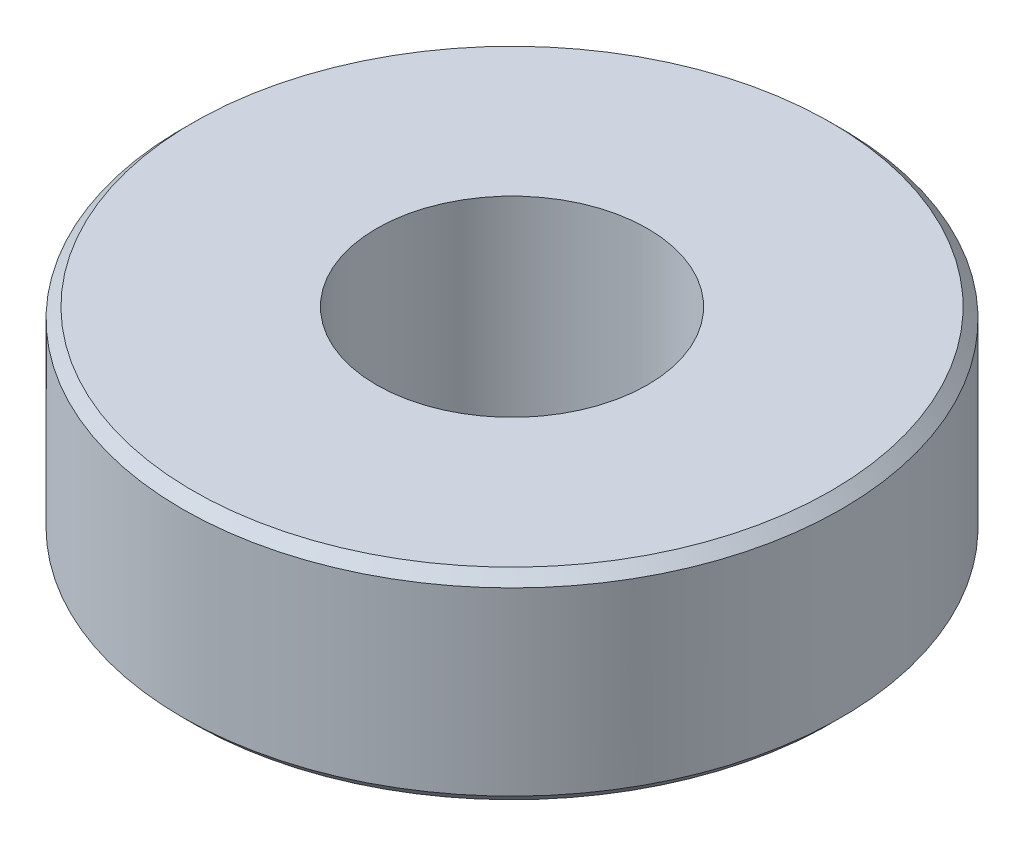
ISO-10303-21;
HEADER;
FILE_DESCRIPTION(('STEP AP214'),'2;1');
FILE_NAME('part.step','',(''),(''),'','','');
FILE_SCHEMA(('AUTOMOTIVE_DESIGN { 1 0 10303 214 1 1 1 1 }'));
ENDSEC;
DATA;
#1=APPLICATION_CONTEXT('core data for automotive mechanical design processes');
#2=APPLICATION_PROTOCOL_DEFINITION('international standard','automotive_design',2000,#1);
#3=PRODUCT_CONTEXT('',#1,'mechanical');
#4=PRODUCT('Part','Part','',(#3));
#5=PRODUCT_RELATED_PRODUCT_CATEGORY('part','',(#4));
#6=PRODUCT_DEFINITION_FORMATION('','',#4);
#7=PRODUCT_DEFINITION_CONTEXT('part definition',#1,'design');
#8=PRODUCT_DEFINITION('design','',#6,#7);
#9=PRODUCT_DEFINITION_SHAPE('','',#8);
#10=(LENGTH_UNIT() NAMED_UNIT(*) SI_UNIT(.MILLI.,.METRE.));
#11=(NAMED_UNIT(*) PLANE_ANGLE_UNIT() SI_UNIT($,.RADIAN.));
#12=(NAMED_UNIT(*) SI_UNIT($,.STERADIAN.) SOLID_ANGLE_UNIT());
#13=UNCERTAINTY_MEASURE_WITH_UNIT(LENGTH_MEASURE(1.E-05),#10,'distance_accuracy_value','');
#14=(GEOMETRIC_REPRESENTATION_CONTEXT(3) GLOBAL_UNCERTAINTY_ASSIGNED_CONTEXT((#13)) GLOBAL_UNIT_ASSIGNED_CONTEXT((#10,
#11,#12)) REPRESENTATION_CONTEXT('',''));
#15=CARTESIAN_POINT('',(0.,0.,0.));
#16=DIRECTION('',(0.,0.,1.));
#17=DIRECTION('',(1.,0.,0.));
#18=AXIS2_PLACEMENT_3D('',#15,#16,#17);
#19=CARTESIAN_POINT('',(0.,-47.3192446211727,13.335));
#20=DIRECTION('',(0.,-1.,0.));
#21=DIRECTION('',(1.,0.,0.));
#22=AXIS2_PLACEMENT_3D('',#19,#20,#21);
#23=CONICAL_SURFACE('',#22,7.9375,0.785398163397448);
#24=CARTESIAN_POINT('',(0.,-47.3192446211727,13.335));
#25=DIRECTION('',(0.,1.,0.));
#26=DIRECTION('',(0.,0.,1.));
#27=AXIS2_PLACEMENT_3D('',#24,#25,#26);
#28=CIRCLE('',#27,7.9375);
#29=CARTESIAN_POINT('',(0.,-47.3192446211727,21.2725));
#30=VERTEX_POINT('',#29);
#31=EDGE_CURVE('E29',#30,#30,#28,.F.);
#32=ORIENTED_EDGE('',*,*,#31,.F.);
#33=EDGE_LOOP('',(#32));
#34=FACE_BOUND('',#33,.T.);
#35=CARTESIAN_POINT('',(0.,-47.0652446211727,13.335));
#36=DIRECTION('',(0.,-1.,0.));
#37=DIRECTION('',(1.,0.,0.));
#38=AXIS2_PLACEMENT_3D('',#35,#36,#37);
#39=CIRCLE('',#38,7.6835);
#40=CARTESIAN_POINT('',(7.68349999999993,-47.0652446211727,13.335));
#41=VERTEX_POINT('',#40);
#42=EDGE_CURVE('E17',#41,#41,#39,.T.);
#43=ORIENTED_EDGE('',*,*,#42,.T.);
#44=EDGE_LOOP('',(#43));
#45=FACE_BOUND('',#44,.T.);
#46=ADVANCED_FACE('F14',(#34,#45),#23,.T.);
#47=CARTESIAN_POINT('',(0.,-47.0652446211727,13.335));
#48=DIRECTION('',(0.,-1.,0.));
#49=DIRECTION('',(0.,0.,-1.));
#50=AXIS2_PLACEMENT_3D('',#47,#48,#49);
#51=PLANE('',#50);
#52=ORIENTED_EDGE('',*,*,#42,.F.);
#53=EDGE_LOOP('',(#52));
#54=FACE_BOUND('',#53,.T.);
#55=CARTESIAN_POINT('',(0.,-47.0652446211727,13.335));
#56=DIRECTION('',(0.,-1.,0.));
#57=DIRECTION('',(0.,0.,-1.));
#58=AXIS2_PLACEMENT_3D('',#55,#56,#57);
#59=CIRCLE('',#58,3.2639);
#60=CARTESIAN_POINT('',(0.,-47.0652446211727,10.0711));
#61=VERTEX_POINT('',#60);
#62=EDGE_CURVE('E31',#61,#61,#59,.T.);
#63=ORIENTED_EDGE('',*,*,#62,.T.);
#64=EDGE_LOOP('',(#63));
#65=FACE_BOUND('',#64,.T.);
#66=ADVANCED_FACE('F43',(#54,#65),#51,.F.);
#67=CARTESIAN_POINT('',(0.,-51.9166446211727,13.335));
#68=DIRECTION('',(0.,1.,0.));
#69=DIRECTION('',(0.,0.,1.));
#70=AXIS2_PLACEMENT_3D('',#67,#68,#69);
#71=CYLINDRICAL_SURFACE('',#70,7.9375);
#72=ORIENTED_EDGE('',*,*,#31,.T.);
#73=EDGE_LOOP('',(#72));
#74=FACE_BOUND('',#73,.T.);
#75=CARTESIAN_POINT('',(0.,-51.6626446211727,13.335));
#76=DIRECTION('',(0.,1.,0.));
#77=DIRECTION('',(0.,0.,-1.));
#78=AXIS2_PLACEMENT_3D('',#75,#76,#77);
#79=CIRCLE('',#78,7.9375);
#80=CARTESIAN_POINT('',(0.,-51.6626446211727,5.3975));
#81=VERTEX_POINT('',#80);
#82=EDGE_CURVE('E26',#81,#81,#79,.F.);
#83=ORIENTED_EDGE('',*,*,#82,.F.);
#84=EDGE_LOOP('',(#83));
#85=FACE_BOUND('',#84,.T.);
#86=ADVANCED_FACE('F45',(#74,#85),#71,.T.);
#87=CARTESIAN_POINT('',(0.,-47.0652446211727,13.335));
#88=DIRECTION('',(0.,-1.,0.));
#89=DIRECTION('',(0.,0.,-1.));
#90=AXIS2_PLACEMENT_3D('',#87,#88,#89);
#91=CYLINDRICAL_SURFACE('',#90,3.2639);
#92=CARTESIAN_POINT('',(0.,-51.9166446211727,13.335));
#93=DIRECTION('',(0.,-1.,0.));
#94=DIRECTION('',(0.,0.,-1.));
#95=AXIS2_PLACEMENT_3D('',#92,#93,#94);
#96=CIRCLE('',#95,3.2639);
#97=CARTESIAN_POINT('',(0.,-51.9166446211727,10.0711));
#98=VERTEX_POINT('',#97);
#99=EDGE_CURVE('E21',#98,#98,#96,.F.);
#100=ORIENTED_EDGE('',*,*,#99,.F.);
#101=EDGE_LOOP('',(#100));
#102=FACE_BOUND('',#101,.T.);
#103=ORIENTED_EDGE('',*,*,#62,.F.);
#104=EDGE_LOOP('',(#103));
#105=FACE_BOUND('',#104,.T.);
#106=ADVANCED_FACE('F51',(#102,#105),#91,.F.);
#107=CARTESIAN_POINT('',(0.,-51.6626446211727,13.335));
#108=DIRECTION('',(0.,1.,0.));
#109=DIRECTION('',(-1.,0.,0.));
#110=AXIS2_PLACEMENT_3D('',#107,#108,#109);
#111=CONICAL_SURFACE('',#110,7.9375,0.785398163397445);
#112=ORIENTED_EDGE('',*,*,#82,.T.);
#113=EDGE_LOOP('',(#112));
#114=FACE_BOUND('',#113,.T.);
#115=CARTESIAN_POINT('',(0.,-51.9166446211727,13.335));
#116=DIRECTION('',(0.,1.,0.));
#117=DIRECTION('',(-1.,0.,0.));
#118=AXIS2_PLACEMENT_3D('',#115,#116,#117);
#119=CIRCLE('',#118,7.68350000000001);
#120=CARTESIAN_POINT('',(-7.68350000000008,-51.9166446211727,13.335));
#121=VERTEX_POINT('',#120);
#122=EDGE_CURVE('E10',#121,#121,#119,.F.);
#123=ORIENTED_EDGE('',*,*,#122,.F.);
#124=EDGE_LOOP('',(#123));
#125=FACE_BOUND('',#124,.T.);
#126=ADVANCED_FACE('F56',(#114,#125),#111,.T.);
#127=CARTESIAN_POINT('',(0.,-51.9166446211727,13.335));
#128=DIRECTION('',(0.,-1.,0.));
#129=DIRECTION('',(0.,0.,-1.));
#130=AXIS2_PLACEMENT_3D('',#127,#128,#129);
#131=PLANE('',#130);
#132=ORIENTED_EDGE('',*,*,#122,.T.);
#133=EDGE_LOOP('',(#132));
#134=FACE_BOUND('',#133,.T.);
#135=ORIENTED_EDGE('',*,*,#99,.T.);
#136=EDGE_LOOP('',(#135));
#137=FACE_BOUND('',#136,.T.);
#138=ADVANCED_FACE('F54',(#134,#137),#131,.T.);
#139=CLOSED_SHELL('',(#46,#66,#86,#106,#126,#138));
#140=MANIFOLD_SOLID_BREP('B1',#139);
#141=ADVANCED_BREP_SHAPE_REPRESENTATION('',(#18,#140),#14);
#142=SHAPE_DEFINITION_REPRESENTATION(#9,#141);
ENDSEC;
END-ISO-10303-21;
